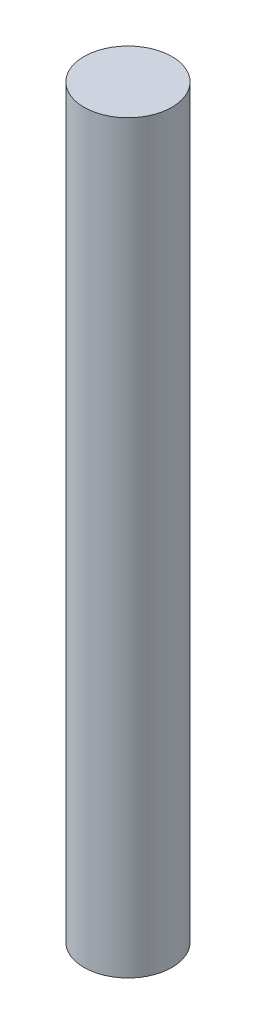
ISO-10303-21;
HEADER;
FILE_DESCRIPTION(('STEP AP214'),'2;1');
FILE_NAME('part.step','',(''),(''),'','','');
FILE_SCHEMA(('AUTOMOTIVE_DESIGN { 1 0 10303 214 1 1 1 1 }'));
ENDSEC;
DATA;
#1=APPLICATION_CONTEXT('core data for automotive mechanical design processes');
#2=APPLICATION_PROTOCOL_DEFINITION('international standard','automotive_design',2000,#1);
#3=PRODUCT_CONTEXT('',#1,'mechanical');
#4=PRODUCT('Part','Part','',(#3));
#5=PRODUCT_RELATED_PRODUCT_CATEGORY('part','',(#4));
#6=PRODUCT_DEFINITION_FORMATION('','',#4);
#7=PRODUCT_DEFINITION_CONTEXT('part definition',#1,'design');
#8=PRODUCT_DEFINITION('design','',#6,#7);
#9=PRODUCT_DEFINITION_SHAPE('','',#8);
#10=(LENGTH_UNIT() NAMED_UNIT(*) SI_UNIT(.MILLI.,.METRE.));
#11=(NAMED_UNIT(*) PLANE_ANGLE_UNIT() SI_UNIT($,.RADIAN.));
#12=(NAMED_UNIT(*) SI_UNIT($,.STERADIAN.) SOLID_ANGLE_UNIT());
#13=UNCERTAINTY_MEASURE_WITH_UNIT(LENGTH_MEASURE(1.E-05),#10,'distance_accuracy_value','');
#14=(GEOMETRIC_REPRESENTATION_CONTEXT(3) GLOBAL_UNCERTAINTY_ASSIGNED_CONTEXT((#13)) GLOBAL_UNIT_ASSIGNED_CONTEXT((#10,
#11,#12)) REPRESENTATION_CONTEXT('',''));
#15=CARTESIAN_POINT('',(0.,0.,0.));
#16=DIRECTION('',(0.,0.,1.));
#17=DIRECTION('',(1.,0.,0.));
#18=AXIS2_PLACEMENT_3D('',#15,#16,#17);
#19=CARTESIAN_POINT('',(0.,125.,0.));
#20=DIRECTION('',(0.,-1.,0.));
#21=DIRECTION('',(0.,0.,-1.));
#22=AXIS2_PLACEMENT_3D('',#19,#20,#21);
#23=CYLINDRICAL_SURFACE('',#22,7.375);
#24=CARTESIAN_POINT('',(0.,125.,0.));
#25=DIRECTION('',(0.,1.,0.));
#26=DIRECTION('',(0.,0.,1.));
#27=AXIS2_PLACEMENT_3D('',#24,#25,#26);
#28=CIRCLE('',#27,7.375);
#29=CARTESIAN_POINT('',(0.,125.,7.375));
#30=VERTEX_POINT('',#29);
#31=EDGE_CURVE('E10',#30,#30,#28,.T.);
#32=ORIENTED_EDGE('',*,*,#31,.F.);
#33=EDGE_LOOP('',(#32));
#34=FACE_BOUND('',#33,.T.);
#35=CARTESIAN_POINT('',(0.,0.,0.));
#36=DIRECTION('',(0.,1.,0.));
#37=DIRECTION('',(0.,0.,1.));
#38=AXIS2_PLACEMENT_3D('',#35,#36,#37);
#39=CIRCLE('',#38,7.375);
#40=CARTESIAN_POINT('',(0.,0.,7.375));
#41=VERTEX_POINT('',#40);
#42=EDGE_CURVE('E33',#41,#41,#39,.T.);
#43=ORIENTED_EDGE('',*,*,#42,.T.);
#44=EDGE_LOOP('',(#43));
#45=FACE_BOUND('',#44,.T.);
#46=ADVANCED_FACE('F30',(#34,#45),#23,.T.);
#47=CARTESIAN_POINT('',(0.,125.,0.));
#48=DIRECTION('',(0.,1.,0.));
#49=DIRECTION('',(0.,0.,1.));
#50=AXIS2_PLACEMENT_3D('',#47,#48,#49);
#51=PLANE('',#50);
#52=ORIENTED_EDGE('',*,*,#31,.T.);
#53=EDGE_LOOP('',(#52));
#54=FACE_BOUND('',#53,.T.);
#55=ADVANCED_FACE('F45',(#54),#51,.T.);
#56=CARTESIAN_POINT('',(0.,0.,0.));
#57=DIRECTION('',(0.,1.,0.));
#58=DIRECTION('',(0.,0.,1.));
#59=AXIS2_PLACEMENT_3D('',#56,#57,#58);
#60=PLANE('',#59);
#61=ORIENTED_EDGE('',*,*,#42,.F.);
#62=EDGE_LOOP('',(#61));
#63=FACE_BOUND('',#62,.T.);
#64=ADVANCED_FACE('F43',(#63),#60,.F.);
#65=CLOSED_SHELL('',(#46,#55,#64));
#66=MANIFOLD_SOLID_BREP('B2',#65);
#67=ADVANCED_BREP_SHAPE_REPRESENTATION('',(#18,#66),#14);
#68=SHAPE_DEFINITION_REPRESENTATION(#9,#67);
ENDSEC;
END-ISO-10303-21;
